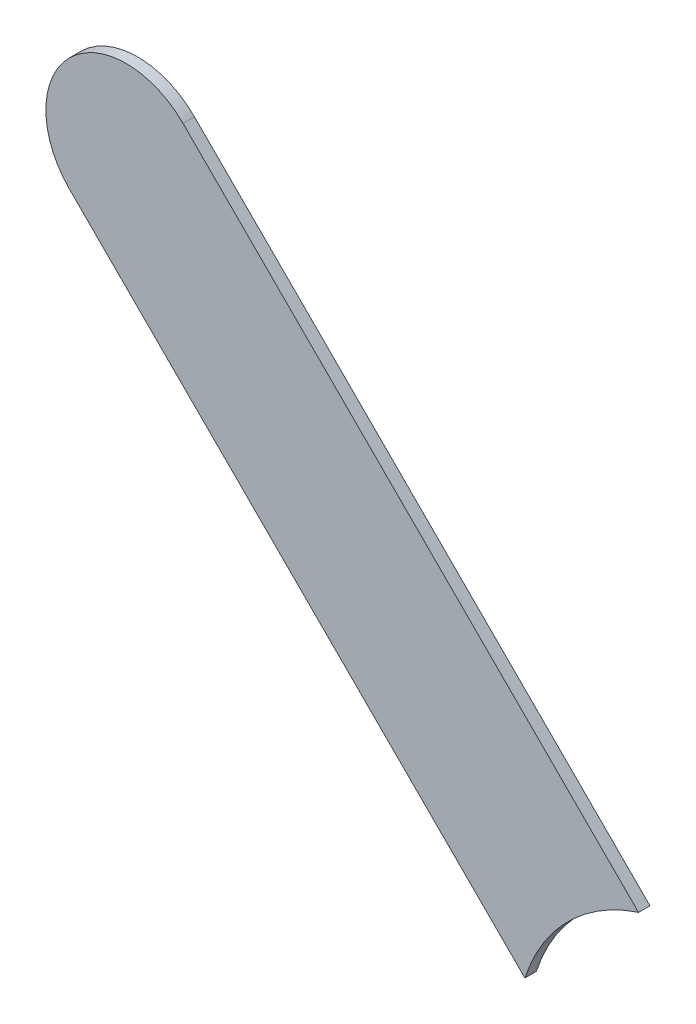
ISO-10303-21;
HEADER;
FILE_DESCRIPTION(('STEP AP214'),'2;1');
FILE_NAME('part.step','',(''),(''),'','','');
FILE_SCHEMA(('AUTOMOTIVE_DESIGN { 1 0 10303 214 1 1 1 1 }'));
ENDSEC;
DATA;
#1=APPLICATION_CONTEXT('core data for automotive mechanical design processes');
#2=APPLICATION_PROTOCOL_DEFINITION('international standard','automotive_design',2000,#1);
#3=PRODUCT_CONTEXT('',#1,'mechanical');
#4=PRODUCT('Part','Part','',(#3));
#5=PRODUCT_RELATED_PRODUCT_CATEGORY('part','',(#4));
#6=PRODUCT_DEFINITION_FORMATION('','',#4);
#7=PRODUCT_DEFINITION_CONTEXT('part definition',#1,'design');
#8=PRODUCT_DEFINITION('design','',#6,#7);
#9=PRODUCT_DEFINITION_SHAPE('','',#8);
#10=(LENGTH_UNIT() NAMED_UNIT(*) SI_UNIT(.MILLI.,.METRE.));
#11=(NAMED_UNIT(*) PLANE_ANGLE_UNIT() SI_UNIT($,.RADIAN.));
#12=(NAMED_UNIT(*) SI_UNIT($,.STERADIAN.) SOLID_ANGLE_UNIT());
#13=UNCERTAINTY_MEASURE_WITH_UNIT(LENGTH_MEASURE(1.E-05),#10,'distance_accuracy_value','');
#14=(GEOMETRIC_REPRESENTATION_CONTEXT(3) GLOBAL_UNCERTAINTY_ASSIGNED_CONTEXT((#13)) GLOBAL_UNIT_ASSIGNED_CONTEXT((#10,
#11,#12)) REPRESENTATION_CONTEXT('',''));
#15=CARTESIAN_POINT('',(0.,0.,0.));
#16=DIRECTION('',(0.,0.,1.));
#17=DIRECTION('',(1.,0.,0.));
#18=AXIS2_PLACEMENT_3D('',#15,#16,#17);
#19=CARTESIAN_POINT('',(94.76401926,67.82322478,0.));
#20=DIRECTION('',(0.70710678118655,0.707106781186545,0.));
#21=DIRECTION('',(0.707106781186545,-0.70710678118655,0.));
#22=AXIS2_PLACEMENT_3D('',#19,#20,#21);
#23=PLANE('',#22);
#24=DIRECTION('',(0.707106781186545,-0.70710678118655,0.));
#25=VECTOR('',#24,1.);
#26=CARTESIAN_POINT('',(94.76401926,67.82322478,0.03556));
#27=LINE('',#26,#25);
#28=CARTESIAN_POINT('',(94.76401926,67.82322478,0.03556));
#29=VERTEX_POINT('',#28);
#30=CARTESIAN_POINT('',(96.1809641708294,66.4062798691706,0.03556));
#31=VERTEX_POINT('',#30);
#32=EDGE_CURVE('E11',#29,#31,#27,.T.);
#33=ORIENTED_EDGE('',*,*,#32,.F.);
#34=DIRECTION('',(0.,0.,1.));
#35=VECTOR('',#34,1.);
#36=CARTESIAN_POINT('',(94.76401926,67.82322478,0.));
#37=LINE('',#36,#35);
#38=CARTESIAN_POINT('',(94.76401926,67.82322478,0.));
#39=VERTEX_POINT('',#38);
#40=EDGE_CURVE('E24',#39,#29,#37,.T.);
#41=ORIENTED_EDGE('',*,*,#40,.F.);
#42=DIRECTION('',(0.707106781186545,-0.70710678118655,0.));
#43=VECTOR('',#42,1.);
#44=CARTESIAN_POINT('',(94.76401926,67.82322478,0.));
#45=LINE('',#44,#43);
#46=CARTESIAN_POINT('',(96.1809641708294,66.4062798691706,0.));
#47=VERTEX_POINT('',#46);
#48=EDGE_CURVE('E75',#39,#47,#45,.T.);
#49=ORIENTED_EDGE('',*,*,#48,.T.);
#50=DIRECTION('',(0.,0.,1.));
#51=VECTOR('',#50,1.);
#52=CARTESIAN_POINT('',(96.1809641708294,66.4062798691706,0.));
#53=LINE('',#52,#51);
#54=EDGE_CURVE('E37',#47,#31,#53,.T.);
#55=ORIENTED_EDGE('',*,*,#54,.T.);
#56=EDGE_LOOP('',(#33,#41,#49,#55));
#57=FACE_BOUND('',#56,.T.);
#58=ADVANCED_FACE('F17',(#57),#23,.F.);
#59=CARTESIAN_POINT('',(96.70415,66.2366468,0.));
#60=DIRECTION('',(0.,0.,-1.));
#61=DIRECTION('',(1.,0.,0.));
#62=AXIS2_PLACEMENT_3D('',#59,#60,#61);
#63=CYLINDRICAL_SURFACE('',#62,0.5499989);
#64=DIRECTION('',(0.,0.,1.));
#65=VECTOR('',#64,1.);
#66=CARTESIAN_POINT('',(96.5345169308294,66.7598326291706,0.));
#67=LINE('',#66,#65);
#68=CARTESIAN_POINT('',(96.5345169308294,66.7598326291706,0.));
#69=VERTEX_POINT('',#68);
#70=CARTESIAN_POINT('',(96.5345169308294,66.7598326291706,0.03556));
#71=VERTEX_POINT('',#70);
#72=EDGE_CURVE('E67',#69,#71,#67,.T.);
#73=ORIENTED_EDGE('',*,*,#72,.T.);
#74=CARTESIAN_POINT('',(96.70415,66.2366468,0.03556));
#75=DIRECTION('',(0.,0.,1.));
#76=DIRECTION('',(1.,0.,0.));
#77=AXIS2_PLACEMENT_3D('',#74,#75,#76);
#78=CIRCLE('',#77,0.5499989);
#79=EDGE_CURVE('E82',#71,#31,#78,.T.);
#80=ORIENTED_EDGE('',*,*,#79,.T.);
#81=ORIENTED_EDGE('',*,*,#54,.F.);
#82=CARTESIAN_POINT('',(96.70415,66.2366468,0.));
#83=DIRECTION('',(0.,0.,1.));
#84=DIRECTION('',(1.,0.,0.));
#85=AXIS2_PLACEMENT_3D('',#82,#83,#84);
#86=CIRCLE('',#85,0.5499989);
#87=EDGE_CURVE('E80',#69,#47,#86,.T.);
#88=ORIENTED_EDGE('',*,*,#87,.F.);
#89=EDGE_LOOP('',(#73,#80,#81,#88));
#90=FACE_BOUND('',#89,.T.);
#91=ADVANCED_FACE('F88',(#90),#63,.F.);
#92=CARTESIAN_POINT('',(96.5345169308294,66.7598326291706,0.));
#93=DIRECTION('',(-0.707106781186548,-0.707106781186548,0.));
#94=DIRECTION('',(-0.707106781186548,0.707106781186548,0.));
#95=AXIS2_PLACEMENT_3D('',#92,#93,#94);
#96=PLANE('',#95);
#97=DIRECTION('',(-0.707106781186548,0.707106781186548,0.));
#98=VECTOR('',#97,1.);
#99=CARTESIAN_POINT('',(96.88092638,66.41342318,0.03556));
#100=LINE('',#99,#98);
#101=CARTESIAN_POINT('',(95.11757202,68.17677754,0.03556));
#102=VERTEX_POINT('',#101);
#103=EDGE_CURVE('E71',#71,#102,#100,.T.);
#104=ORIENTED_EDGE('',*,*,#103,.F.);
#105=ORIENTED_EDGE('',*,*,#72,.F.);
#106=DIRECTION('',(-0.707106781186548,0.707106781186548,0.));
#107=VECTOR('',#106,1.);
#108=CARTESIAN_POINT('',(96.88092638,66.41342318,0.));
#109=LINE('',#108,#107);
#110=CARTESIAN_POINT('',(95.11757202,68.17677754,0.));
#111=VERTEX_POINT('',#110);
#112=EDGE_CURVE('E63',#69,#111,#109,.T.);
#113=ORIENTED_EDGE('',*,*,#112,.T.);
#114=DIRECTION('',(0.,0.,1.));
#115=VECTOR('',#114,1.);
#116=CARTESIAN_POINT('',(95.11757202,68.17677754,0.));
#117=LINE('',#116,#115);
#118=EDGE_CURVE('E53',#111,#102,#117,.T.);
#119=ORIENTED_EDGE('',*,*,#118,.T.);
#120=EDGE_LOOP('',(#104,#105,#113,#119));
#121=FACE_BOUND('',#120,.T.);
#122=ADVANCED_FACE('F66',(#121),#96,.F.);
#123=CARTESIAN_POINT('',(94.94079564,68.00000116,0.));
#124=DIRECTION('',(0.,0.,-1.));
#125=DIRECTION('',(0.707106781186548,0.707106781186548,0.));
#126=AXIS2_PLACEMENT_3D('',#123,#124,#125);
#127=CYLINDRICAL_SURFACE('',#126,0.249999554103216);
#128=CARTESIAN_POINT('',(94.94079564,68.00000116,0.03556));
#129=DIRECTION('',(0.,0.,1.));
#130=DIRECTION('',(0.707106781186548,0.707106781186548,0.));
#131=AXIS2_PLACEMENT_3D('',#128,#129,#130);
#132=CIRCLE('',#131,0.249999554103216);
#133=EDGE_CURVE('E59',#102,#29,#132,.T.);
#134=ORIENTED_EDGE('',*,*,#133,.F.);
#135=ORIENTED_EDGE('',*,*,#118,.F.);
#136=CARTESIAN_POINT('',(94.94079564,68.00000116,0.));
#137=DIRECTION('',(0.,0.,1.));
#138=DIRECTION('',(0.707106781186548,0.707106781186548,0.));
#139=AXIS2_PLACEMENT_3D('',#136,#137,#138);
#140=CIRCLE('',#139,0.249999554103216);
#141=EDGE_CURVE('E57',#111,#39,#140,.T.);
#142=ORIENTED_EDGE('',*,*,#141,.T.);
#143=ORIENTED_EDGE('',*,*,#40,.T.);
#144=EDGE_LOOP('',(#134,#135,#142,#143));
#145=FACE_BOUND('',#144,.T.);
#146=ADVANCED_FACE('F55',(#145),#127,.T.);
#147=CARTESIAN_POINT('',(94.76401926,67.82322478,0.));
#148=DIRECTION('',(0.,0.,-1.));
#149=DIRECTION('',(-1.,0.,0.));
#150=AXIS2_PLACEMENT_3D('',#147,#148,#149);
#151=PLANE('',#150);
#152=ORIENTED_EDGE('',*,*,#48,.F.);
#153=ORIENTED_EDGE('',*,*,#141,.F.);
#154=ORIENTED_EDGE('',*,*,#112,.F.);
#155=ORIENTED_EDGE('',*,*,#87,.T.);
#156=EDGE_LOOP('',(#152,#153,#154,#155));
#157=FACE_BOUND('',#156,.T.);
#158=ADVANCED_FACE('F74',(#157),#151,.T.);
#159=CARTESIAN_POINT('',(94.76401926,67.82322478,0.03556));
#160=DIRECTION('',(0.,0.,-1.));
#161=DIRECTION('',(-1.,0.,0.));
#162=AXIS2_PLACEMENT_3D('',#159,#160,#161);
#163=PLANE('',#162);
#164=ORIENTED_EDGE('',*,*,#133,.T.);
#165=ORIENTED_EDGE('',*,*,#32,.T.);
#166=ORIENTED_EDGE('',*,*,#79,.F.);
#167=ORIENTED_EDGE('',*,*,#103,.T.);
#168=EDGE_LOOP('',(#164,#165,#166,#167));
#169=FACE_BOUND('',#168,.T.);
#170=ADVANCED_FACE('F91',(#169),#163,.F.);
#171=CLOSED_SHELL('',(#58,#91,#122,#146,#158,#170));
#172=MANIFOLD_SOLID_BREP('B1',#171);
#173=ADVANCED_BREP_SHAPE_REPRESENTATION('',(#18,#172),#14);
#174=SHAPE_DEFINITION_REPRESENTATION(#9,#173);
ENDSEC;
END-ISO-10303-21;
